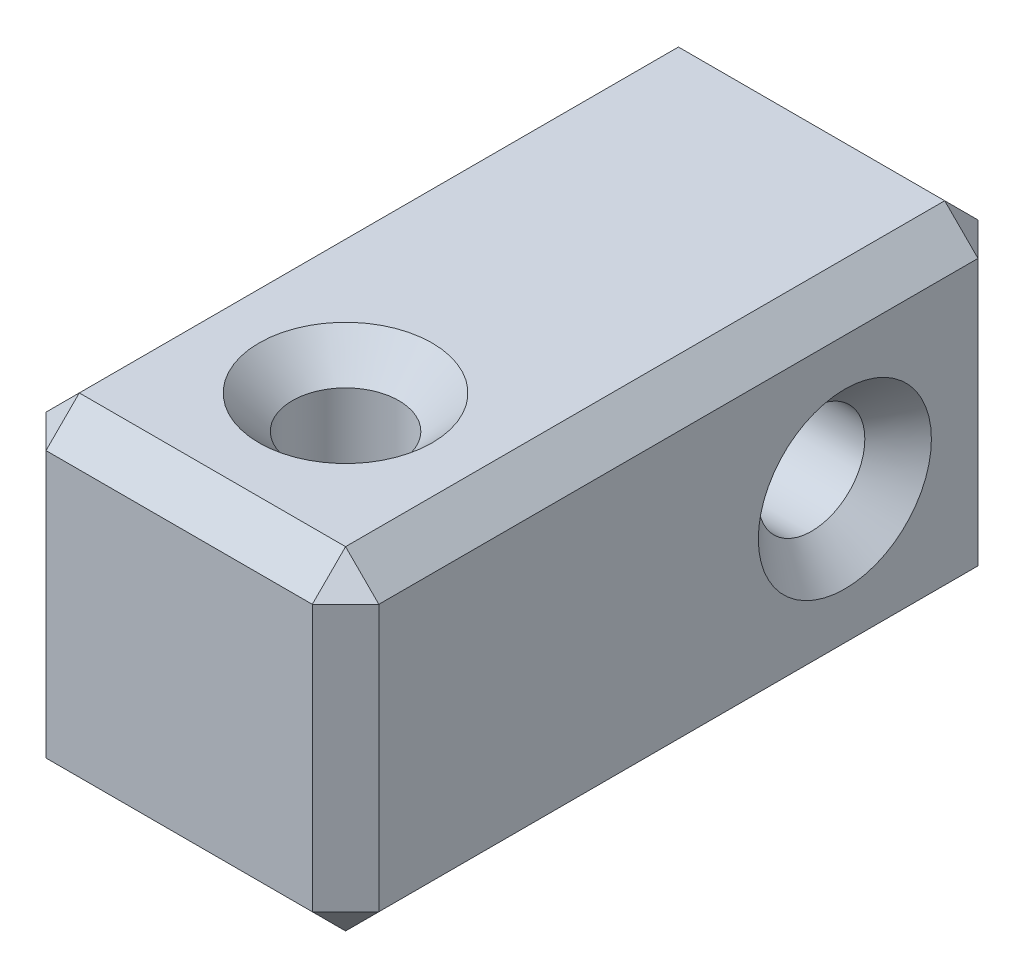
ISO-10303-21;
HEADER;
FILE_DESCRIPTION(('STEP AP214'),'2;1');
FILE_NAME('part.step','',(''),(''),'','','');
FILE_SCHEMA(('AUTOMOTIVE_DESIGN { 1 0 10303 214 1 1 1 1 }'));
ENDSEC;
DATA;
#1=APPLICATION_CONTEXT('core data for automotive mechanical design processes');
#2=APPLICATION_PROTOCOL_DEFINITION('international standard','automotive_design',2000,#1);
#3=PRODUCT_CONTEXT('',#1,'mechanical');
#4=PRODUCT('Part','Part','',(#3));
#5=PRODUCT_RELATED_PRODUCT_CATEGORY('part','',(#4));
#6=PRODUCT_DEFINITION_FORMATION('','',#4);
#7=PRODUCT_DEFINITION_CONTEXT('part definition',#1,'design');
#8=PRODUCT_DEFINITION('design','',#6,#7);
#9=PRODUCT_DEFINITION_SHAPE('','',#8);
#10=(LENGTH_UNIT() NAMED_UNIT(*) SI_UNIT(.MILLI.,.METRE.));
#11=(NAMED_UNIT(*) PLANE_ANGLE_UNIT() SI_UNIT($,.RADIAN.));
#12=(NAMED_UNIT(*) SI_UNIT($,.STERADIAN.) SOLID_ANGLE_UNIT());
#13=UNCERTAINTY_MEASURE_WITH_UNIT(LENGTH_MEASURE(1.E-05),#10,'distance_accuracy_value','');
#14=(GEOMETRIC_REPRESENTATION_CONTEXT(3) GLOBAL_UNCERTAINTY_ASSIGNED_CONTEXT((#13)) GLOBAL_UNIT_ASSIGNED_CONTEXT((#10,
#11,#12)) REPRESENTATION_CONTEXT('',''));
#15=CARTESIAN_POINT('',(0.,0.,0.));
#16=DIRECTION('',(0.,0.,1.));
#17=DIRECTION('',(1.,0.,0.));
#18=AXIS2_PLACEMENT_3D('',#15,#16,#17);
#19=CARTESIAN_POINT('',(-2.5,-2.,0.5));
#20=DIRECTION('',(-0.577350269189626,-0.577350269189624,-0.577350269189628));
#21=DIRECTION('',(-0.707106781186549,0.,0.707106781186546));
#22=AXIS2_PLACEMENT_3D('',#19,#20,#21);
#23=PLANE('',#22);
#24=DIRECTION('',(-0.707106781186549,0.,0.707106781186546));
#25=VECTOR('',#24,1.);
#26=CARTESIAN_POINT('',(-2.5,-2.,0.5));
#27=LINE('',#26,#25);
#28=CARTESIAN_POINT('',(-2.,-2.,0.));
#29=VERTEX_POINT('',#28);
#30=CARTESIAN_POINT('',(-2.5,-2.,0.5));
#31=VERTEX_POINT('',#30);
#32=EDGE_CURVE('E150',#29,#31,#27,.T.);
#33=ORIENTED_EDGE('',*,*,#32,.F.);
#34=DIRECTION('',(0.,0.707106781186549,-0.707106781186546));
#35=VECTOR('',#34,1.);
#36=CARTESIAN_POINT('',(-2.,-2.5,0.5));
#37=LINE('',#36,#35);
#38=CARTESIAN_POINT('',(-2.,-2.5,0.5));
#39=VERTEX_POINT('',#38);
#40=EDGE_CURVE('E201',#39,#29,#37,.T.);
#41=ORIENTED_EDGE('',*,*,#40,.F.);
#42=DIRECTION('',(-0.707106781186546,0.707106781186549,0.));
#43=VECTOR('',#42,1.);
#44=CARTESIAN_POINT('',(-2.,-2.5,0.5));
#45=LINE('',#44,#43);
#46=EDGE_CURVE('E104',#39,#31,#45,.T.);
#47=ORIENTED_EDGE('',*,*,#46,.T.);
#48=EDGE_LOOP('',(#33,#41,#47));
#49=FACE_BOUND('',#48,.T.);
#50=ADVANCED_FACE('F17',(#49),#23,.T.);
#51=CARTESIAN_POINT('',(2.5,0.,2.5));
#52=DIRECTION('',(1.,0.,0.));
#53=DIRECTION('',(0.,0.,-1.));
#54=AXIS2_PLACEMENT_3D('',#51,#52,#53);
#55=CYLINDRICAL_SURFACE('',#54,0.8);
#56=CARTESIAN_POINT('',(2.00000000006639,0.,2.5));
#57=DIRECTION('',(1.,0.,0.));
#58=DIRECTION('',(0.,0.,-1.));
#59=AXIS2_PLACEMENT_3D('',#56,#57,#58);
#60=CIRCLE('',#59,0.799999999971988);
#61=CARTESIAN_POINT('',(2.00000000006639,0.,1.70000000002801));
#62=VERTEX_POINT('',#61);
#63=EDGE_CURVE('E148',#62,#62,#60,.T.);
#64=ORIENTED_EDGE('',*,*,#63,.T.);
#65=EDGE_LOOP('',(#64));
#66=FACE_BOUND('',#65,.T.);
#67=CARTESIAN_POINT('',(-2.00000000006639,0.,2.5));
#68=DIRECTION('',(-1.,0.,0.));
#69=DIRECTION('',(0.,0.,1.));
#70=AXIS2_PLACEMENT_3D('',#67,#68,#69);
#71=CIRCLE('',#70,0.800000000024284);
#72=CARTESIAN_POINT('',(-2.00000000006639,0.,3.30000000002428));
#73=VERTEX_POINT('',#72);
#74=EDGE_CURVE('E139',#73,#73,#71,.T.);
#75=ORIENTED_EDGE('',*,*,#74,.T.);
#76=EDGE_LOOP('',(#75));
#77=FACE_BOUND('',#76,.T.);
#78=ADVANCED_FACE('F345',(#66,#77),#55,.F.);
#79=CARTESIAN_POINT('',(2.,-2.,0.));
#80=DIRECTION('',(0.577350269189626,-0.577350269189624,-0.577350269189628));
#81=DIRECTION('',(-0.707106781186549,0.,-0.707106781186546));
#82=AXIS2_PLACEMENT_3D('',#79,#80,#81);
#83=PLANE('',#82);
#84=DIRECTION('',(-0.707106781186549,0.,-0.707106781186546));
#85=VECTOR('',#84,1.);
#86=CARTESIAN_POINT('',(2.5,-2.,0.5));
#87=LINE('',#86,#85);
#88=CARTESIAN_POINT('',(2.5,-2.,0.5));
#89=VERTEX_POINT('',#88);
#90=CARTESIAN_POINT('',(2.,-2.,0.));
#91=VERTEX_POINT('',#90);
#92=EDGE_CURVE('E186',#89,#91,#87,.T.);
#93=ORIENTED_EDGE('',*,*,#92,.F.);
#94=DIRECTION('',(-0.707106781186546,-0.707106781186549,0.));
#95=VECTOR('',#94,1.);
#96=CARTESIAN_POINT('',(2.5,-2.,0.5));
#97=LINE('',#96,#95);
#98=CARTESIAN_POINT('',(2.,-2.5,0.5));
#99=VERTEX_POINT('',#98);
#100=EDGE_CURVE('E188',#89,#99,#97,.T.);
#101=ORIENTED_EDGE('',*,*,#100,.T.);
#102=DIRECTION('',(0.,0.707106781186549,-0.707106781186546));
#103=VECTOR('',#102,1.);
#104=CARTESIAN_POINT('',(2.,-2.5,0.5));
#105=LINE('',#104,#103);
#106=EDGE_CURVE('E199',#91,#99,#105,.F.);
#107=ORIENTED_EDGE('',*,*,#106,.F.);
#108=EDGE_LOOP('',(#93,#101,#107));
#109=FACE_BOUND('',#108,.T.);
#110=ADVANCED_FACE('F312',(#109),#83,.T.);
#111=CARTESIAN_POINT('',(2.5,-2.,9.5));
#112=DIRECTION('',(0.577350269189628,-0.577350269189624,0.577350269189626));
#113=DIRECTION('',(0.707106781186546,0.,-0.707106781186549));
#114=AXIS2_PLACEMENT_3D('',#111,#112,#113);
#115=PLANE('',#114);
#116=DIRECTION('',(-0.707106781186546,-0.707106781186549,0.));
#117=VECTOR('',#116,1.);
#118=CARTESIAN_POINT('',(2.5,-2.,9.5));
#119=LINE('',#118,#117);
#120=CARTESIAN_POINT('',(2.,-2.5,9.5));
#121=VERTEX_POINT('',#120);
#122=CARTESIAN_POINT('',(2.5,-2.,9.5));
#123=VERTEX_POINT('',#122);
#124=EDGE_CURVE('E191',#121,#123,#119,.F.);
#125=ORIENTED_EDGE('',*,*,#124,.T.);
#126=DIRECTION('',(-0.707106781186546,0.,0.707106781186549));
#127=VECTOR('',#126,1.);
#128=CARTESIAN_POINT('',(2.,-2.,10.));
#129=LINE('',#128,#127);
#130=CARTESIAN_POINT('',(2.,-2.,10.));
#131=VERTEX_POINT('',#130);
#132=EDGE_CURVE('E178',#123,#131,#129,.T.);
#133=ORIENTED_EDGE('',*,*,#132,.T.);
#134=DIRECTION('',(0.,0.707106781186549,0.707106781186546));
#135=VECTOR('',#134,1.);
#136=CARTESIAN_POINT('',(2.,-2.,10.));
#137=LINE('',#136,#135);
#138=EDGE_CURVE('E125',#131,#121,#137,.F.);
#139=ORIENTED_EDGE('',*,*,#138,.T.);
#140=EDGE_LOOP('',(#125,#133,#139));
#141=FACE_BOUND('',#140,.T.);
#142=ADVANCED_FACE('F318',(#141),#115,.T.);
#143=CARTESIAN_POINT('',(-2.5,-2.5,10.));
#144=DIRECTION('',(0.,1.,0.));
#145=DIRECTION('',(0.,0.,1.));
#146=AXIS2_PLACEMENT_3D('',#143,#144,#145);
#147=PLANE('',#146);
#148=CARTESIAN_POINT('',(0.,-2.49999999999773,7.5));
#149=DIRECTION('',(0.,-1.,0.));
#150=DIRECTION('',(0.,0.,-1.));
#151=AXIS2_PLACEMENT_3D('',#148,#149,#150);
#152=CIRCLE('',#151,1.29999999996471);
#153=CARTESIAN_POINT('',(0.,-2.49999999999773,6.20000000003529));
#154=VERTEX_POINT('',#153);
#155=EDGE_CURVE('E20',#154,#154,#152,.F.);
#156=ORIENTED_EDGE('',*,*,#155,.T.);
#157=EDGE_LOOP('',(#156));
#158=FACE_BOUND('',#157,.T.);
#159=DIRECTION('',(0.,0.,1.));
#160=VECTOR('',#159,1.);
#161=CARTESIAN_POINT('',(-2.,-2.5,10.));
#162=LINE('',#161,#160);
#163=CARTESIAN_POINT('',(-2.,-2.5,9.5));
#164=VERTEX_POINT('',#163);
#165=EDGE_CURVE('E107',#164,#39,#162,.F.);
#166=ORIENTED_EDGE('',*,*,#165,.T.);
#167=DIRECTION('',(1.,0.,0.));
#168=VECTOR('',#167,1.);
#169=CARTESIAN_POINT('',(-2.5,-2.5,0.5));
#170=LINE('',#169,#168);
#171=EDGE_CURVE('E196',#99,#39,#170,.F.);
#172=ORIENTED_EDGE('',*,*,#171,.F.);
#173=DIRECTION('',(0.,0.,1.));
#174=VECTOR('',#173,1.);
#175=CARTESIAN_POINT('',(2.,-2.5,10.));
#176=LINE('',#175,#174);
#177=EDGE_CURVE('E122',#99,#121,#176,.T.);
#178=ORIENTED_EDGE('',*,*,#177,.T.);
#179=DIRECTION('',(1.,0.,0.));
#180=VECTOR('',#179,1.);
#181=CARTESIAN_POINT('',(0.,-2.5,9.5));
#182=LINE('',#181,#180);
#183=EDGE_CURVE('E118',#121,#164,#182,.F.);
#184=ORIENTED_EDGE('',*,*,#183,.T.);
#185=EDGE_LOOP('',(#166,#172,#178,#184));
#186=FACE_BOUND('',#185,.T.);
#187=ADVANCED_FACE('F120',(#158,#186),#147,.F.);
#188=CARTESIAN_POINT('',(-2.,-2.,10.));
#189=DIRECTION('',(-0.577350269189628,-0.577350269189624,0.577350269189626));
#190=DIRECTION('',(0.707106781186546,0.,0.707106781186549));
#191=AXIS2_PLACEMENT_3D('',#188,#189,#190);
#192=PLANE('',#191);
#193=DIRECTION('',(-0.707106781186546,0.707106781186549,0.));
#194=VECTOR('',#193,1.);
#195=CARTESIAN_POINT('',(-2.,-2.5,9.5));
#196=LINE('',#195,#194);
#197=CARTESIAN_POINT('',(-2.5,-2.,9.5));
#198=VERTEX_POINT('',#197);
#199=EDGE_CURVE('E111',#198,#164,#196,.F.);
#200=ORIENTED_EDGE('',*,*,#199,.T.);
#201=DIRECTION('',(0.,0.707106781186549,0.707106781186546));
#202=VECTOR('',#201,1.);
#203=CARTESIAN_POINT('',(-2.,-2.,10.));
#204=LINE('',#203,#202);
#205=CARTESIAN_POINT('',(-2.,-2.,10.));
#206=VERTEX_POINT('',#205);
#207=EDGE_CURVE('E124',#164,#206,#204,.T.);
#208=ORIENTED_EDGE('',*,*,#207,.T.);
#209=DIRECTION('',(-0.707106781186546,0.,-0.707106781186549));
#210=VECTOR('',#209,1.);
#211=CARTESIAN_POINT('',(-2.,-2.,10.));
#212=LINE('',#211,#210);
#213=EDGE_CURVE('E137',#206,#198,#212,.T.);
#214=ORIENTED_EDGE('',*,*,#213,.T.);
#215=EDGE_LOOP('',(#200,#208,#214));
#216=FACE_BOUND('',#215,.T.);
#217=ADVANCED_FACE('F136',(#216),#192,.T.);
#218=CARTESIAN_POINT('',(0.,-2.49999999999773,7.5));
#219=DIRECTION('',(0.,-1.,0.));
#220=DIRECTION('',(0.,0.,-1.));
#221=AXIS2_PLACEMENT_3D('',#218,#219,#220);
#222=CONICAL_SURFACE('',#221,1.29999999996471,0.785398163454292);
#223=ORIENTED_EDGE('',*,*,#155,.F.);
#224=EDGE_LOOP('',(#223));
#225=FACE_BOUND('',#224,.T.);
#226=CARTESIAN_POINT('',(0.,-1.99999999999999,7.5));
#227=DIRECTION('',(0.,1.,0.));
#228=DIRECTION('',(0.,0.,1.));
#229=AXIS2_PLACEMENT_3D('',#226,#227,#228);
#230=CIRCLE('',#229,0.799999999999993);
#231=CARTESIAN_POINT('',(0.,-1.99999999999999,8.29999999999999));
#232=VERTEX_POINT('',#231);
#233=EDGE_CURVE('E134',#232,#232,#230,.T.);
#234=ORIENTED_EDGE('',*,*,#233,.T.);
#235=EDGE_LOOP('',(#234));
#236=FACE_BOUND('',#235,.T.);
#237=ADVANCED_FACE('F352',(#225,#236),#222,.F.);
#238=CARTESIAN_POINT('',(-2.50000000011141,0.,2.5));
#239=DIRECTION('',(-1.,0.,0.));
#240=DIRECTION('',(0.,0.,1.));
#241=AXIS2_PLACEMENT_3D('',#238,#239,#240);
#242=CONICAL_SURFACE('',#241,1.3000000000693,0.785398163397448);
#243=CARTESIAN_POINT('',(-2.50000000005457,0.,2.5));
#244=DIRECTION('',(-1.,0.,0.));
#245=DIRECTION('',(0.,0.,1.));
#246=AXIS2_PLACEMENT_3D('',#243,#244,#245);
#247=CIRCLE('',#246,1.30000000001246);
#248=CARTESIAN_POINT('',(-2.50000000005457,0.,3.80000000001246));
#249=VERTEX_POINT('',#248);
#250=EDGE_CURVE('E147',#249,#249,#247,.T.);
#251=ORIENTED_EDGE('',*,*,#250,.T.);
#252=EDGE_LOOP('',(#251));
#253=FACE_BOUND('',#252,.T.);
#254=ORIENTED_EDGE('',*,*,#74,.F.);
#255=EDGE_LOOP('',(#254));
#256=FACE_BOUND('',#255,.T.);
#257=ADVANCED_FACE('F350',(#253,#256),#242,.F.);
#258=CARTESIAN_POINT('',(-2.,-2.5,10.));
#259=DIRECTION('',(0.707106781186549,0.707106781186546,0.));
#260=DIRECTION('',(-0.707106781186546,0.707106781186549,0.));
#261=AXIS2_PLACEMENT_3D('',#258,#259,#260);
#262=PLANE('',#261);
#263=ORIENTED_EDGE('',*,*,#165,.F.);
#264=ORIENTED_EDGE('',*,*,#199,.F.);
#265=DIRECTION('',(0.,0.,-1.));
#266=VECTOR('',#265,1.);
#267=CARTESIAN_POINT('',(-2.5,-2.,10.));
#268=LINE('',#267,#266);
#269=EDGE_CURVE('E162',#198,#31,#268,.T.);
#270=ORIENTED_EDGE('',*,*,#269,.T.);
#271=ORIENTED_EDGE('',*,*,#46,.F.);
#272=EDGE_LOOP('',(#263,#264,#270,#271));
#273=FACE_BOUND('',#272,.T.);
#274=ADVANCED_FACE('F109',(#273),#262,.F.);
#275=CARTESIAN_POINT('',(-2.5,-2.5,0.5));
#276=DIRECTION('',(0.,-0.707106781186546,-0.707106781186549));
#277=DIRECTION('',(0.,0.707106781186549,-0.707106781186546));
#278=AXIS2_PLACEMENT_3D('',#275,#276,#277);
#279=PLANE('',#278);
#280=ORIENTED_EDGE('',*,*,#106,.T.);
#281=ORIENTED_EDGE('',*,*,#171,.T.);
#282=ORIENTED_EDGE('',*,*,#40,.T.);
#283=DIRECTION('',(-1.,0.,0.));
#284=VECTOR('',#283,1.);
#285=CARTESIAN_POINT('',(0.,-2.,0.));
#286=LINE('',#285,#284);
#287=EDGE_CURVE('E255',#91,#29,#286,.T.);
#288=ORIENTED_EDGE('',*,*,#287,.F.);
#289=EDGE_LOOP('',(#280,#281,#282,#288));
#290=FACE_BOUND('',#289,.T.);
#291=ADVANCED_FACE('F310',(#290),#279,.T.);
#292=CARTESIAN_POINT('',(-2.5,-2.5,0.5));
#293=DIRECTION('',(-0.707106781186546,0.,-0.707106781186549));
#294=DIRECTION('',(-0.707106781186549,0.,0.707106781186546));
#295=AXIS2_PLACEMENT_3D('',#292,#293,#294);
#296=PLANE('',#295);
#297=DIRECTION('',(-0.707106781186549,0.,0.707106781186546));
#298=VECTOR('',#297,1.);
#299=CARTESIAN_POINT('',(-2.,2.,0.));
#300=LINE('',#299,#298);
#301=CARTESIAN_POINT('',(-2.,2.,0.));
#302=VERTEX_POINT('',#301);
#303=CARTESIAN_POINT('',(-2.5,2.,0.5));
#304=VERTEX_POINT('',#303);
#305=EDGE_CURVE('E217',#302,#304,#300,.T.);
#306=ORIENTED_EDGE('',*,*,#305,.F.);
#307=DIRECTION('',(0.,1.,0.));
#308=VECTOR('',#307,1.);
#309=CARTESIAN_POINT('',(-2.,0.,0.));
#310=LINE('',#309,#308);
#311=EDGE_CURVE('E160',#29,#302,#310,.T.);
#312=ORIENTED_EDGE('',*,*,#311,.F.);
#313=ORIENTED_EDGE('',*,*,#32,.T.);
#314=DIRECTION('',(0.,1.,0.));
#315=VECTOR('',#314,1.);
#316=CARTESIAN_POINT('',(-2.5,-2.5,0.5));
#317=LINE('',#316,#315);
#318=EDGE_CURVE('E165',#31,#304,#317,.T.);
#319=ORIENTED_EDGE('',*,*,#318,.T.);
#320=EDGE_LOOP('',(#306,#312,#313,#319));
#321=FACE_BOUND('',#320,.T.);
#322=ADVANCED_FACE('F216',(#321),#296,.T.);
#323=CARTESIAN_POINT('',(2.49999999994088,0.,2.5));
#324=DIRECTION('',(1.,0.,0.));
#325=DIRECTION('',(0.,0.,-1.));
#326=AXIS2_PLACEMENT_3D('',#323,#324,#325);
#327=CONICAL_SURFACE('',#326,1.29999999984648,0.785398163397448);
#328=CARTESIAN_POINT('',(2.49999999999773,0.,2.5));
#329=DIRECTION('',(1.,0.,0.));
#330=DIRECTION('',(0.,0.,-1.));
#331=AXIS2_PLACEMENT_3D('',#328,#329,#330);
#332=CIRCLE('',#331,1.29999999990332);
#333=CARTESIAN_POINT('',(2.49999999999773,0.,1.20000000009668));
#334=VERTEX_POINT('',#333);
#335=EDGE_CURVE('E157',#334,#334,#332,.T.);
#336=ORIENTED_EDGE('',*,*,#335,.T.);
#337=EDGE_LOOP('',(#336));
#338=FACE_BOUND('',#337,.T.);
#339=ORIENTED_EDGE('',*,*,#63,.F.);
#340=EDGE_LOOP('',(#339));
#341=FACE_BOUND('',#340,.T.);
#342=ADVANCED_FACE('F339',(#338,#341),#327,.F.);
#343=CARTESIAN_POINT('',(2.5,-2.,10.));
#344=DIRECTION('',(-0.707106781186549,0.707106781186546,0.));
#345=DIRECTION('',(-0.707106781186546,-0.707106781186549,0.));
#346=AXIS2_PLACEMENT_3D('',#343,#344,#345);
#347=PLANE('',#346);
#348=DIRECTION('',(0.,0.,1.));
#349=VECTOR('',#348,1.);
#350=CARTESIAN_POINT('',(2.5,-2.,10.));
#351=LINE('',#350,#349);
#352=EDGE_CURVE('E159',#89,#123,#351,.T.);
#353=ORIENTED_EDGE('',*,*,#352,.T.);
#354=ORIENTED_EDGE('',*,*,#124,.F.);
#355=ORIENTED_EDGE('',*,*,#177,.F.);
#356=ORIENTED_EDGE('',*,*,#100,.F.);
#357=EDGE_LOOP('',(#353,#354,#355,#356));
#358=FACE_BOUND('',#357,.T.);
#359=ADVANCED_FACE('F315',(#358),#347,.F.);
#360=CARTESIAN_POINT('',(2.5,-2.5,0.5));
#361=DIRECTION('',(0.707106781186546,0.,-0.707106781186549));
#362=DIRECTION('',(-0.707106781186549,0.,-0.707106781186546));
#363=AXIS2_PLACEMENT_3D('',#360,#361,#362);
#364=PLANE('',#363);
#365=DIRECTION('',(-0.707106781186549,0.,-0.707106781186546));
#366=VECTOR('',#365,1.);
#367=CARTESIAN_POINT('',(2.5,2.,0.5));
#368=LINE('',#367,#366);
#369=CARTESIAN_POINT('',(2.,2.,0.));
#370=VERTEX_POINT('',#369);
#371=CARTESIAN_POINT('',(2.5,2.,0.5));
#372=VERTEX_POINT('',#371);
#373=EDGE_CURVE('E184',#370,#372,#368,.F.);
#374=ORIENTED_EDGE('',*,*,#373,.T.);
#375=DIRECTION('',(0.,1.,0.));
#376=VECTOR('',#375,1.);
#377=CARTESIAN_POINT('',(2.5,-2.5,0.5));
#378=LINE('',#377,#376);
#379=EDGE_CURVE('E246',#372,#89,#378,.F.);
#380=ORIENTED_EDGE('',*,*,#379,.T.);
#381=ORIENTED_EDGE('',*,*,#92,.T.);
#382=DIRECTION('',(0.,1.,0.));
#383=VECTOR('',#382,1.);
#384=CARTESIAN_POINT('',(2.,0.,0.));
#385=LINE('',#384,#383);
#386=EDGE_CURVE('E258',#370,#91,#385,.F.);
#387=ORIENTED_EDGE('',*,*,#386,.F.);
#388=EDGE_LOOP('',(#374,#380,#381,#387));
#389=FACE_BOUND('',#388,.T.);
#390=ADVANCED_FACE('F302',(#389),#364,.T.);
#391=CARTESIAN_POINT('',(-2.,0.,10.));
#392=DIRECTION('',(0.707106781186549,0.,-0.707106781186546));
#393=DIRECTION('',(-0.707106781186546,0.,-0.707106781186549));
#394=AXIS2_PLACEMENT_3D('',#391,#392,#393);
#395=PLANE('',#394);
#396=DIRECTION('',(0.,1.,0.));
#397=VECTOR('',#396,1.);
#398=CARTESIAN_POINT('',(-2.5,-2.5,9.5));
#399=LINE('',#398,#397);
#400=CARTESIAN_POINT('',(-2.5,2.,9.5));
#401=VERTEX_POINT('',#400);
#402=EDGE_CURVE('E168',#401,#198,#399,.F.);
#403=ORIENTED_EDGE('',*,*,#402,.T.);
#404=ORIENTED_EDGE('',*,*,#213,.F.);
#405=DIRECTION('',(0.,1.,0.));
#406=VECTOR('',#405,1.);
#407=CARTESIAN_POINT('',(-2.,0.,10.));
#408=LINE('',#407,#406);
#409=CARTESIAN_POINT('',(-2.,2.,10.));
#410=VERTEX_POINT('',#409);
#411=EDGE_CURVE('E241',#206,#410,#408,.T.);
#412=ORIENTED_EDGE('',*,*,#411,.T.);
#413=DIRECTION('',(-0.707106781186546,0.,-0.707106781186549));
#414=VECTOR('',#413,1.);
#415=CARTESIAN_POINT('',(-2.,2.,10.));
#416=LINE('',#415,#414);
#417=EDGE_CURVE('E181',#401,#410,#416,.F.);
#418=ORIENTED_EDGE('',*,*,#417,.F.);
#419=EDGE_LOOP('',(#403,#404,#412,#418));
#420=FACE_BOUND('',#419,.T.);
#421=ADVANCED_FACE('F262',(#420),#395,.F.);
#422=CARTESIAN_POINT('',(2.,0.,10.));
#423=DIRECTION('',(-0.707106781186549,0.,-0.707106781186546));
#424=DIRECTION('',(-0.707106781186546,0.,0.707106781186549));
#425=AXIS2_PLACEMENT_3D('',#422,#423,#424);
#426=PLANE('',#425);
#427=DIRECTION('',(0.,1.,0.));
#428=VECTOR('',#427,1.);
#429=CARTESIAN_POINT('',(2.5,-2.5,9.5));
#430=LINE('',#429,#428);
#431=CARTESIAN_POINT('',(2.5,2.,9.5));
#432=VERTEX_POINT('',#431);
#433=EDGE_CURVE('E249',#123,#432,#430,.T.);
#434=ORIENTED_EDGE('',*,*,#433,.T.);
#435=DIRECTION('',(0.707106781186546,0.,-0.707106781186549));
#436=VECTOR('',#435,1.);
#437=CARTESIAN_POINT('',(2.,2.,10.));
#438=LINE('',#437,#436);
#439=CARTESIAN_POINT('',(2.,2.,10.));
#440=VERTEX_POINT('',#439);
#441=EDGE_CURVE('E244',#440,#432,#438,.T.);
#442=ORIENTED_EDGE('',*,*,#441,.F.);
#443=DIRECTION('',(0.,1.,0.));
#444=VECTOR('',#443,1.);
#445=CARTESIAN_POINT('',(2.,0.,10.));
#446=LINE('',#445,#444);
#447=EDGE_CURVE('E238',#440,#131,#446,.F.);
#448=ORIENTED_EDGE('',*,*,#447,.T.);
#449=ORIENTED_EDGE('',*,*,#132,.F.);
#450=EDGE_LOOP('',(#434,#442,#448,#449));
#451=FACE_BOUND('',#450,.T.);
#452=ADVANCED_FACE('F323',(#451),#426,.F.);
#453=CARTESIAN_POINT('',(0.,-2.,10.));
#454=DIRECTION('',(0.,0.707106781186546,-0.707106781186549));
#455=DIRECTION('',(0.,0.707106781186549,0.707106781186546));
#456=AXIS2_PLACEMENT_3D('',#453,#454,#455);
#457=PLANE('',#456);
#458=ORIENTED_EDGE('',*,*,#183,.F.);
#459=ORIENTED_EDGE('',*,*,#138,.F.);
#460=DIRECTION('',(-1.,0.,0.));
#461=VECTOR('',#460,1.);
#462=CARTESIAN_POINT('',(0.,-2.,10.));
#463=LINE('',#462,#461);
#464=EDGE_CURVE('E131',#131,#206,#463,.T.);
#465=ORIENTED_EDGE('',*,*,#464,.T.);
#466=ORIENTED_EDGE('',*,*,#207,.F.);
#467=EDGE_LOOP('',(#458,#459,#465,#466));
#468=FACE_BOUND('',#467,.T.);
#469=ADVANCED_FACE('F129',(#468),#457,.F.);
#470=CARTESIAN_POINT('',(0.,2.5,7.5));
#471=DIRECTION('',(0.,1.,0.));
#472=DIRECTION('',(0.,0.,1.));
#473=AXIS2_PLACEMENT_3D('',#470,#471,#472);
#474=CYLINDRICAL_SURFACE('',#473,0.799999999999993);
#475=CARTESIAN_POINT('',(0.,2.00000000006639,7.5));
#476=DIRECTION('',(0.,1.,0.));
#477=DIRECTION('',(0.,0.,1.));
#478=AXIS2_PLACEMENT_3D('',#475,#476,#477);
#479=CIRCLE('',#478,0.800000000019736);
#480=CARTESIAN_POINT('',(0.,2.00000000006639,8.30000000001974));
#481=VERTEX_POINT('',#480);
#482=EDGE_CURVE('E172',#481,#481,#479,.T.);
#483=ORIENTED_EDGE('',*,*,#482,.T.);
#484=EDGE_LOOP('',(#483));
#485=FACE_BOUND('',#484,.T.);
#486=ORIENTED_EDGE('',*,*,#233,.F.);
#487=EDGE_LOOP('',(#486));
#488=FACE_BOUND('',#487,.T.);
#489=ADVANCED_FACE('F394',(#485,#488),#474,.F.);
#490=CARTESIAN_POINT('',(-2.5,-2.5,10.));
#491=DIRECTION('',(1.,0.,0.));
#492=DIRECTION('',(0.,0.,-1.));
#493=AXIS2_PLACEMENT_3D('',#490,#491,#492);
#494=PLANE('',#493);
#495=DIRECTION('',(0.,0.,1.));
#496=VECTOR('',#495,1.);
#497=CARTESIAN_POINT('',(-2.5,2.,10.));
#498=LINE('',#497,#496);
#499=EDGE_CURVE('E212',#401,#304,#498,.F.);
#500=ORIENTED_EDGE('',*,*,#499,.T.);
#501=ORIENTED_EDGE('',*,*,#318,.F.);
#502=ORIENTED_EDGE('',*,*,#269,.F.);
#503=ORIENTED_EDGE('',*,*,#402,.F.);
#504=EDGE_LOOP('',(#500,#501,#502,#503));
#505=FACE_BOUND('',#504,.T.);
#506=ORIENTED_EDGE('',*,*,#250,.F.);
#507=EDGE_LOOP('',(#506));
#508=FACE_BOUND('',#507,.T.);
#509=ADVANCED_FACE('F208',(#505,#508),#494,.F.);
#510=CARTESIAN_POINT('',(-2.,2.5,0.5));
#511=DIRECTION('',(-0.577350269189624,0.577350269189626,-0.577350269189628));
#512=DIRECTION('',(0.,0.707106781186549,0.707106781186546));
#513=AXIS2_PLACEMENT_3D('',#510,#511,#512);
#514=PLANE('',#513);
#515=ORIENTED_EDGE('',*,*,#305,.T.);
#516=DIRECTION('',(0.707106781186549,0.707106781186546,0.));
#517=VECTOR('',#516,1.);
#518=CARTESIAN_POINT('',(-2.5,2.,0.5));
#519=LINE('',#518,#517);
#520=CARTESIAN_POINT('',(-2.,2.5,0.5));
#521=VERTEX_POINT('',#520);
#522=EDGE_CURVE('E222',#304,#521,#519,.T.);
#523=ORIENTED_EDGE('',*,*,#522,.T.);
#524=DIRECTION('',(0.,0.707106781186549,0.707106781186546));
#525=VECTOR('',#524,1.);
#526=CARTESIAN_POINT('',(-2.,2.5,0.5));
#527=LINE('',#526,#525);
#528=EDGE_CURVE('E229',#302,#521,#527,.T.);
#529=ORIENTED_EDGE('',*,*,#528,.F.);
#530=EDGE_LOOP('',(#515,#523,#529));
#531=FACE_BOUND('',#530,.T.);
#532=ADVANCED_FACE('F389',(#531),#514,.T.);
#533=CARTESIAN_POINT('',(0.,0.,0.));
#534=DIRECTION('',(0.,0.,-1.));
#535=DIRECTION('',(-1.,0.,0.));
#536=AXIS2_PLACEMENT_3D('',#533,#534,#535);
#537=PLANE('',#536);
#538=ORIENTED_EDGE('',*,*,#287,.T.);
#539=ORIENTED_EDGE('',*,*,#311,.T.);
#540=DIRECTION('',(1.,0.,0.));
#541=VECTOR('',#540,1.);
#542=CARTESIAN_POINT('',(-2.5,2.,0.));
#543=LINE('',#542,#541);
#544=EDGE_CURVE('E293',#370,#302,#543,.F.);
#545=ORIENTED_EDGE('',*,*,#544,.F.);
#546=ORIENTED_EDGE('',*,*,#386,.T.);
#547=EDGE_LOOP('',(#538,#539,#545,#546));
#548=FACE_BOUND('',#547,.T.);
#549=ADVANCED_FACE('F307',(#548),#537,.T.);
#550=CARTESIAN_POINT('',(2.5,-2.5,10.));
#551=DIRECTION('',(-1.,0.,0.));
#552=DIRECTION('',(0.,0.,1.));
#553=AXIS2_PLACEMENT_3D('',#550,#551,#552);
#554=PLANE('',#553);
#555=DIRECTION('',(0.,0.,1.));
#556=VECTOR('',#555,1.);
#557=CARTESIAN_POINT('',(2.5,2.,10.));
#558=LINE('',#557,#556);
#559=EDGE_CURVE('E290',#372,#432,#558,.T.);
#560=ORIENTED_EDGE('',*,*,#559,.T.);
#561=ORIENTED_EDGE('',*,*,#433,.F.);
#562=ORIENTED_EDGE('',*,*,#352,.F.);
#563=ORIENTED_EDGE('',*,*,#379,.F.);
#564=EDGE_LOOP('',(#560,#561,#562,#563));
#565=FACE_BOUND('',#564,.T.);
#566=ORIENTED_EDGE('',*,*,#335,.F.);
#567=EDGE_LOOP('',(#566));
#568=FACE_BOUND('',#567,.T.);
#569=ADVANCED_FACE('F332',(#565,#568),#554,.F.);
#570=CARTESIAN_POINT('',(2.5,2.,0.5));
#571=DIRECTION('',(0.577350269189626,0.577350269189624,-0.577350269189628));
#572=DIRECTION('',(-0.707106781186549,0.,-0.707106781186546));
#573=AXIS2_PLACEMENT_3D('',#570,#571,#572);
#574=PLANE('',#573);
#575=DIRECTION('',(0.,0.707106781186549,0.707106781186546));
#576=VECTOR('',#575,1.);
#577=CARTESIAN_POINT('',(2.,2.5,0.5));
#578=LINE('',#577,#576);
#579=CARTESIAN_POINT('',(2.,2.5,0.5));
#580=VERTEX_POINT('',#579);
#581=EDGE_CURVE('E231',#580,#370,#578,.F.);
#582=ORIENTED_EDGE('',*,*,#581,.F.);
#583=DIRECTION('',(0.707106781186546,-0.707106781186549,0.));
#584=VECTOR('',#583,1.);
#585=CARTESIAN_POINT('',(2.,2.5,0.5));
#586=LINE('',#585,#584);
#587=EDGE_CURVE('E285',#580,#372,#586,.T.);
#588=ORIENTED_EDGE('',*,*,#587,.T.);
#589=ORIENTED_EDGE('',*,*,#373,.F.);
#590=EDGE_LOOP('',(#582,#588,#589));
#591=FACE_BOUND('',#590,.T.);
#592=ADVANCED_FACE('F335',(#591),#574,.T.);
#593=CARTESIAN_POINT('',(2.,2.,10.));
#594=DIRECTION('',(0.577350269189628,0.577350269189626,0.577350269189624));
#595=DIRECTION('',(-0.707106781186546,0.707106781186549,0.));
#596=AXIS2_PLACEMENT_3D('',#593,#594,#595);
#597=PLANE('',#596);
#598=DIRECTION('',(0.,0.707106781186546,-0.707106781186549));
#599=VECTOR('',#598,1.);
#600=CARTESIAN_POINT('',(2.,2.,10.));
#601=LINE('',#600,#599);
#602=CARTESIAN_POINT('',(2.,2.5,9.5));
#603=VERTEX_POINT('',#602);
#604=EDGE_CURVE('E34',#603,#440,#601,.F.);
#605=ORIENTED_EDGE('',*,*,#604,.T.);
#606=ORIENTED_EDGE('',*,*,#441,.T.);
#607=DIRECTION('',(0.707106781186546,-0.707106781186549,0.));
#608=VECTOR('',#607,1.);
#609=CARTESIAN_POINT('',(2.,2.5,9.5));
#610=LINE('',#609,#608);
#611=EDGE_CURVE('E288',#432,#603,#610,.F.);
#612=ORIENTED_EDGE('',*,*,#611,.T.);
#613=EDGE_LOOP('',(#605,#606,#612));
#614=FACE_BOUND('',#613,.T.);
#615=ADVANCED_FACE('F327',(#614),#597,.T.);
#616=CARTESIAN_POINT('',(0.,0.,10.));
#617=DIRECTION('',(0.,0.,-1.));
#618=DIRECTION('',(-1.,0.,0.));
#619=AXIS2_PLACEMENT_3D('',#616,#617,#618);
#620=PLANE('',#619);
#621=ORIENTED_EDGE('',*,*,#447,.F.);
#622=DIRECTION('',(1.,0.,0.));
#623=VECTOR('',#622,1.);
#624=CARTESIAN_POINT('',(0.,2.,10.));
#625=LINE('',#624,#623);
#626=EDGE_CURVE('E281',#440,#410,#625,.F.);
#627=ORIENTED_EDGE('',*,*,#626,.T.);
#628=ORIENTED_EDGE('',*,*,#411,.F.);
#629=ORIENTED_EDGE('',*,*,#464,.F.);
#630=EDGE_LOOP('',(#621,#627,#628,#629));
#631=FACE_BOUND('',#630,.T.);
#632=ADVANCED_FACE('F321',(#631),#620,.F.);
#633=CARTESIAN_POINT('',(-2.,2.,10.));
#634=DIRECTION('',(-0.577350269189626,0.577350269189628,0.577350269189624));
#635=DIRECTION('',(-0.707106781186549,-0.707106781186546,0.));
#636=AXIS2_PLACEMENT_3D('',#633,#634,#635);
#637=PLANE('',#636);
#638=ORIENTED_EDGE('',*,*,#417,.T.);
#639=DIRECTION('',(0.,0.707106781186546,-0.707106781186549));
#640=VECTOR('',#639,1.);
#641=CARTESIAN_POINT('',(-2.,2.,10.));
#642=LINE('',#641,#640);
#643=CARTESIAN_POINT('',(-2.,2.5,9.5));
#644=VERTEX_POINT('',#643);
#645=EDGE_CURVE('E156',#410,#644,#642,.T.);
#646=ORIENTED_EDGE('',*,*,#645,.T.);
#647=DIRECTION('',(0.707106781186549,0.707106781186546,0.));
#648=VECTOR('',#647,1.);
#649=CARTESIAN_POINT('',(-2.5,2.,9.5));
#650=LINE('',#649,#648);
#651=EDGE_CURVE('E174',#644,#401,#650,.F.);
#652=ORIENTED_EDGE('',*,*,#651,.T.);
#653=EDGE_LOOP('',(#638,#646,#652));
#654=FACE_BOUND('',#653,.T.);
#655=ADVANCED_FACE('F267',(#654),#637,.T.);
#656=CARTESIAN_POINT('',(0.,2.50000000005457,7.5));
#657=DIRECTION('',(0.,1.,0.));
#658=DIRECTION('',(0.,0.,1.));
#659=AXIS2_PLACEMENT_3D('',#656,#657,#658);
#660=CONICAL_SURFACE('',#659,1.30000000000791,0.785398163397448);
#661=CARTESIAN_POINT('',(0.,2.50000000005457,7.5));
#662=DIRECTION('',(0.,1.,0.));
#663=DIRECTION('',(0.,0.,1.));
#664=AXIS2_PLACEMENT_3D('',#661,#662,#663);
#665=CIRCLE('',#664,1.30000000000791);
#666=CARTESIAN_POINT('',(0.,2.50000000005457,8.80000000000791));
#667=VERTEX_POINT('',#666);
#668=EDGE_CURVE('E152',#667,#667,#665,.T.);
#669=ORIENTED_EDGE('',*,*,#668,.T.);
#670=EDGE_LOOP('',(#669));
#671=FACE_BOUND('',#670,.T.);
#672=ORIENTED_EDGE('',*,*,#482,.F.);
#673=EDGE_LOOP('',(#672));
#674=FACE_BOUND('',#673,.T.);
#675=ADVANCED_FACE('F375',(#671,#674),#660,.F.);
#676=CARTESIAN_POINT('',(-2.5,2.,10.));
#677=DIRECTION('',(0.707106781186546,-0.707106781186549,0.));
#678=DIRECTION('',(0.707106781186549,0.707106781186546,0.));
#679=AXIS2_PLACEMENT_3D('',#676,#677,#678);
#680=PLANE('',#679);
#681=ORIENTED_EDGE('',*,*,#499,.F.);
#682=ORIENTED_EDGE('',*,*,#651,.F.);
#683=DIRECTION('',(0.,0.,-1.));
#684=VECTOR('',#683,1.);
#685=CARTESIAN_POINT('',(-2.,2.5,10.));
#686=LINE('',#685,#684);
#687=EDGE_CURVE('E155',#644,#521,#686,.T.);
#688=ORIENTED_EDGE('',*,*,#687,.T.);
#689=ORIENTED_EDGE('',*,*,#522,.F.);
#690=EDGE_LOOP('',(#681,#682,#688,#689));
#691=FACE_BOUND('',#690,.T.);
#692=ADVANCED_FACE('F223',(#691),#680,.F.);
#693=CARTESIAN_POINT('',(-2.5,2.5,0.5));
#694=DIRECTION('',(0.,0.707106781186546,-0.707106781186549));
#695=DIRECTION('',(0.,0.707106781186549,0.707106781186546));
#696=AXIS2_PLACEMENT_3D('',#693,#694,#695);
#697=PLANE('',#696);
#698=ORIENTED_EDGE('',*,*,#581,.T.);
#699=ORIENTED_EDGE('',*,*,#544,.T.);
#700=ORIENTED_EDGE('',*,*,#528,.T.);
#701=DIRECTION('',(1.,0.,0.));
#702=VECTOR('',#701,1.);
#703=CARTESIAN_POINT('',(-2.5,2.5,0.5));
#704=LINE('',#703,#702);
#705=EDGE_CURVE('E275',#521,#580,#704,.T.);
#706=ORIENTED_EDGE('',*,*,#705,.T.);
#707=EDGE_LOOP('',(#698,#699,#700,#706));
#708=FACE_BOUND('',#707,.T.);
#709=ADVANCED_FACE('F298',(#708),#697,.T.);
#710=CARTESIAN_POINT('',(2.,2.5,10.));
#711=DIRECTION('',(-0.707106781186549,-0.707106781186546,0.));
#712=DIRECTION('',(0.707106781186546,-0.707106781186549,0.));
#713=AXIS2_PLACEMENT_3D('',#710,#711,#712);
#714=PLANE('',#713);
#715=DIRECTION('',(0.,0.,-1.));
#716=VECTOR('',#715,1.);
#717=CARTESIAN_POINT('',(2.,2.5,10.));
#718=LINE('',#717,#716);
#719=EDGE_CURVE('E26',#580,#603,#718,.F.);
#720=ORIENTED_EDGE('',*,*,#719,.T.);
#721=ORIENTED_EDGE('',*,*,#611,.F.);
#722=ORIENTED_EDGE('',*,*,#559,.F.);
#723=ORIENTED_EDGE('',*,*,#587,.F.);
#724=EDGE_LOOP('',(#720,#721,#722,#723));
#725=FACE_BOUND('',#724,.T.);
#726=ADVANCED_FACE('F330',(#725),#714,.F.);
#727=CARTESIAN_POINT('',(0.,2.,10.));
#728=DIRECTION('',(0.,-0.707106781186549,-0.707106781186546));
#729=DIRECTION('',(0.,0.707106781186546,-0.707106781186549));
#730=AXIS2_PLACEMENT_3D('',#727,#728,#729);
#731=PLANE('',#730);
#732=ORIENTED_EDGE('',*,*,#626,.F.);
#733=ORIENTED_EDGE('',*,*,#604,.F.);
#734=DIRECTION('',(1.,0.,0.));
#735=VECTOR('',#734,1.);
#736=CARTESIAN_POINT('',(-2.5,2.5,9.5));
#737=LINE('',#736,#735);
#738=EDGE_CURVE('E11',#603,#644,#737,.F.);
#739=ORIENTED_EDGE('',*,*,#738,.T.);
#740=ORIENTED_EDGE('',*,*,#645,.F.);
#741=EDGE_LOOP('',(#732,#733,#739,#740));
#742=FACE_BOUND('',#741,.T.);
#743=ADVANCED_FACE('F326',(#742),#731,.F.);
#744=CARTESIAN_POINT('',(-2.5,2.5,10.));
#745=DIRECTION('',(0.,-1.,0.));
#746=DIRECTION('',(0.,0.,-1.));
#747=AXIS2_PLACEMENT_3D('',#744,#745,#746);
#748=PLANE('',#747);
#749=ORIENTED_EDGE('',*,*,#719,.F.);
#750=ORIENTED_EDGE('',*,*,#705,.F.);
#751=ORIENTED_EDGE('',*,*,#687,.F.);
#752=ORIENTED_EDGE('',*,*,#738,.F.);
#753=EDGE_LOOP('',(#749,#750,#751,#752));
#754=FACE_BOUND('',#753,.T.);
#755=ORIENTED_EDGE('',*,*,#668,.F.);
#756=EDGE_LOOP('',(#755));
#757=FACE_BOUND('',#756,.T.);
#758=ADVANCED_FACE('F271',(#754,#757),#748,.F.);
#759=CLOSED_SHELL('',(#50,#78,#110,#142,#187,#217,#237,#257,#274,#291,#322,#342,#359,#390,#421,
#452,#469,#489,#509,#532,#549,#569,#592,#615,#632,#655,#675,#692,#709,#726,#743,#758));
#760=MANIFOLD_SOLID_BREP('B1',#759);
#761=ADVANCED_BREP_SHAPE_REPRESENTATION('',(#18,#760),#14);
#762=SHAPE_DEFINITION_REPRESENTATION(#9,#761);
ENDSEC;
END-ISO-10303-21;
